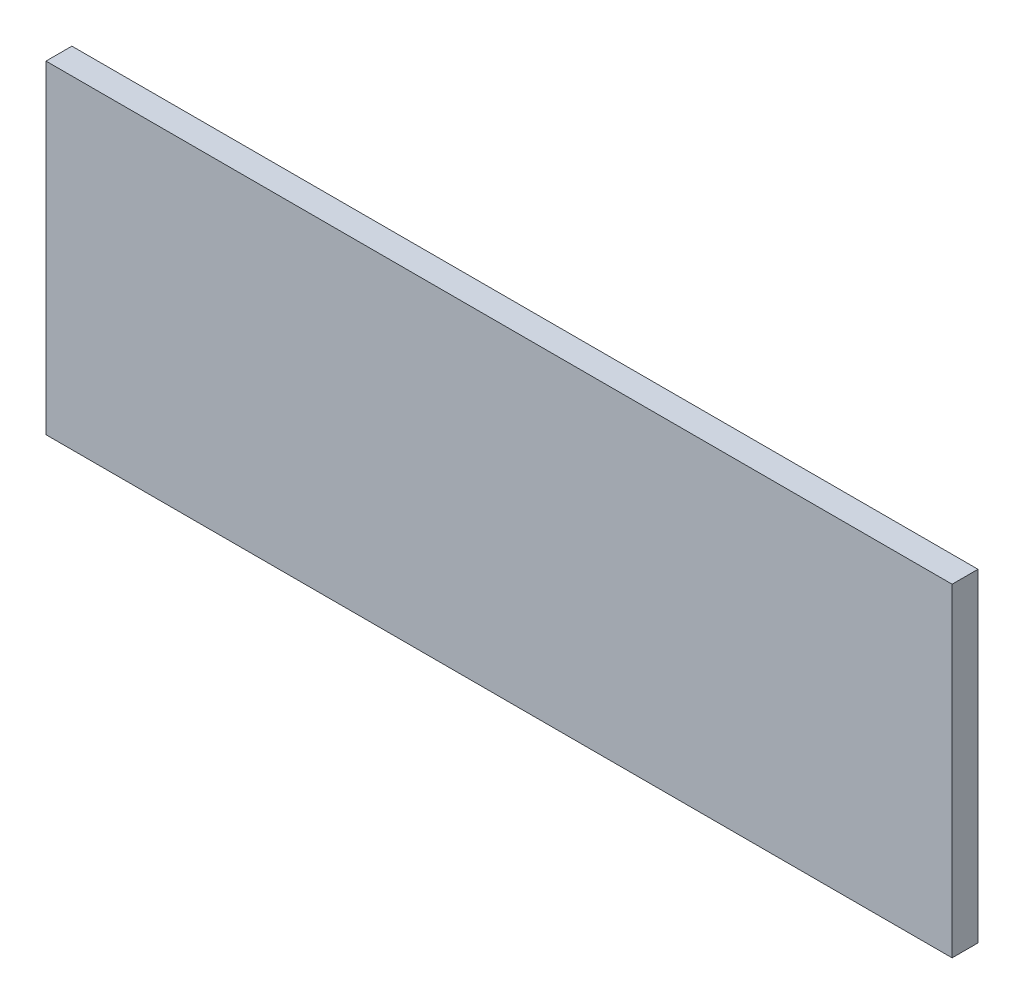
ISO-10303-21;
HEADER;
FILE_DESCRIPTION(('STEP AP214'),'2;1');
FILE_NAME('part.step','',(''),(''),'','','');
FILE_SCHEMA(('AUTOMOTIVE_DESIGN { 1 0 10303 214 1 1 1 1 }'));
ENDSEC;
DATA;
#1=APPLICATION_CONTEXT('core data for automotive mechanical design processes');
#2=APPLICATION_PROTOCOL_DEFINITION('international standard','automotive_design',2000,#1);
#3=PRODUCT_CONTEXT('',#1,'mechanical');
#4=PRODUCT('Part','Part','',(#3));
#5=PRODUCT_RELATED_PRODUCT_CATEGORY('part','',(#4));
#6=PRODUCT_DEFINITION_FORMATION('','',#4);
#7=PRODUCT_DEFINITION_CONTEXT('part definition',#1,'design');
#8=PRODUCT_DEFINITION('design','',#6,#7);
#9=PRODUCT_DEFINITION_SHAPE('','',#8);
#10=(LENGTH_UNIT() NAMED_UNIT(*) SI_UNIT(.MILLI.,.METRE.));
#11=(NAMED_UNIT(*) PLANE_ANGLE_UNIT() SI_UNIT($,.RADIAN.));
#12=(NAMED_UNIT(*) SI_UNIT($,.STERADIAN.) SOLID_ANGLE_UNIT());
#13=UNCERTAINTY_MEASURE_WITH_UNIT(LENGTH_MEASURE(1.E-05),#10,'distance_accuracy_value','');
#14=(GEOMETRIC_REPRESENTATION_CONTEXT(3) GLOBAL_UNCERTAINTY_ASSIGNED_CONTEXT((#13)) GLOBAL_UNIT_ASSIGNED_CONTEXT((#10,
#11,#12)) REPRESENTATION_CONTEXT('',''));
#15=CARTESIAN_POINT('',(0.,0.,0.));
#16=DIRECTION('',(0.,0.,1.));
#17=DIRECTION('',(1.,0.,0.));
#18=AXIS2_PLACEMENT_3D('',#15,#16,#17);
#19=CARTESIAN_POINT('',(-350.,-125.,20.));
#20=DIRECTION('',(1.,0.,0.));
#21=DIRECTION('',(0.,0.,-1.));
#22=AXIS2_PLACEMENT_3D('',#19,#20,#21);
#23=PLANE('',#22);
#24=DIRECTION('',(0.,-1.,0.));
#25=VECTOR('',#24,1.);
#26=CARTESIAN_POINT('',(-350.,-125.,0.));
#27=LINE('',#26,#25);
#28=CARTESIAN_POINT('',(-350.,125.,0.));
#29=VERTEX_POINT('',#28);
#30=CARTESIAN_POINT('',(-350.,-125.,0.));
#31=VERTEX_POINT('',#30);
#32=EDGE_CURVE('E93',#29,#31,#27,.T.);
#33=ORIENTED_EDGE('',*,*,#32,.T.);
#34=DIRECTION('',(0.,0.,-1.));
#35=VECTOR('',#34,1.);
#36=CARTESIAN_POINT('',(-350.,-125.,20.));
#37=LINE('',#36,#35);
#38=CARTESIAN_POINT('',(-350.,-125.,20.));
#39=VERTEX_POINT('',#38);
#40=EDGE_CURVE('E11',#39,#31,#37,.T.);
#41=ORIENTED_EDGE('',*,*,#40,.F.);
#42=DIRECTION('',(0.,-1.,0.));
#43=VECTOR('',#42,1.);
#44=CARTESIAN_POINT('',(-350.,-125.,20.));
#45=LINE('',#44,#43);
#46=CARTESIAN_POINT('',(-350.,125.,20.));
#47=VERTEX_POINT('',#46);
#48=EDGE_CURVE('E81',#47,#39,#45,.T.);
#49=ORIENTED_EDGE('',*,*,#48,.F.);
#50=DIRECTION('',(0.,0.,-1.));
#51=VECTOR('',#50,1.);
#52=CARTESIAN_POINT('',(-350.,125.,20.));
#53=LINE('',#52,#51);
#54=EDGE_CURVE('E89',#47,#29,#53,.T.);
#55=ORIENTED_EDGE('',*,*,#54,.T.);
#56=EDGE_LOOP('',(#33,#41,#49,#55));
#57=FACE_BOUND('',#56,.T.);
#58=ADVANCED_FACE('F30',(#57),#23,.F.);
#59=CARTESIAN_POINT('',(-350.,-125.,20.));
#60=DIRECTION('',(0.,1.,0.));
#61=DIRECTION('',(0.,0.,1.));
#62=AXIS2_PLACEMENT_3D('',#59,#60,#61);
#63=PLANE('',#62);
#64=DIRECTION('',(1.,0.,0.));
#65=VECTOR('',#64,1.);
#66=CARTESIAN_POINT('',(-350.,-125.,0.));
#67=LINE('',#66,#65);
#68=CARTESIAN_POINT('',(350.,-125.,0.));
#69=VERTEX_POINT('',#68);
#70=EDGE_CURVE('E85',#31,#69,#67,.T.);
#71=ORIENTED_EDGE('',*,*,#70,.T.);
#72=DIRECTION('',(0.,0.,-1.));
#73=VECTOR('',#72,1.);
#74=CARTESIAN_POINT('',(350.,-125.,20.));
#75=LINE('',#74,#73);
#76=CARTESIAN_POINT('',(350.,-125.,20.));
#77=VERTEX_POINT('',#76);
#78=EDGE_CURVE('E38',#77,#69,#75,.T.);
#79=ORIENTED_EDGE('',*,*,#78,.F.);
#80=DIRECTION('',(1.,0.,0.));
#81=VECTOR('',#80,1.);
#82=CARTESIAN_POINT('',(-350.,-125.,20.));
#83=LINE('',#82,#81);
#84=EDGE_CURVE('E76',#39,#77,#83,.T.);
#85=ORIENTED_EDGE('',*,*,#84,.F.);
#86=ORIENTED_EDGE('',*,*,#40,.T.);
#87=EDGE_LOOP('',(#71,#79,#85,#86));
#88=FACE_BOUND('',#87,.T.);
#89=ADVANCED_FACE('F84',(#88),#63,.F.);
#90=CARTESIAN_POINT('',(350.,-125.,20.));
#91=DIRECTION('',(-1.,0.,0.));
#92=DIRECTION('',(0.,0.,1.));
#93=AXIS2_PLACEMENT_3D('',#90,#91,#92);
#94=PLANE('',#93);
#95=DIRECTION('',(0.,1.,0.));
#96=VECTOR('',#95,1.);
#97=CARTESIAN_POINT('',(350.,-125.,0.));
#98=LINE('',#97,#96);
#99=CARTESIAN_POINT('',(350.,125.,0.));
#100=VERTEX_POINT('',#99);
#101=EDGE_CURVE('E63',#69,#100,#98,.T.);
#102=ORIENTED_EDGE('',*,*,#101,.T.);
#103=DIRECTION('',(0.,0.,-1.));
#104=VECTOR('',#103,1.);
#105=CARTESIAN_POINT('',(350.,125.,20.));
#106=LINE('',#105,#104);
#107=CARTESIAN_POINT('',(350.,125.,20.));
#108=VERTEX_POINT('',#107);
#109=EDGE_CURVE('E86',#108,#100,#106,.T.);
#110=ORIENTED_EDGE('',*,*,#109,.F.);
#111=DIRECTION('',(0.,1.,0.));
#112=VECTOR('',#111,1.);
#113=CARTESIAN_POINT('',(350.,-125.,20.));
#114=LINE('',#113,#112);
#115=EDGE_CURVE('E79',#77,#108,#114,.T.);
#116=ORIENTED_EDGE('',*,*,#115,.F.);
#117=ORIENTED_EDGE('',*,*,#78,.T.);
#118=EDGE_LOOP('',(#102,#110,#116,#117));
#119=FACE_BOUND('',#118,.T.);
#120=ADVANCED_FACE('F87',(#119),#94,.F.);
#121=CARTESIAN_POINT('',(-350.,125.,20.));
#122=DIRECTION('',(0.,-1.,0.));
#123=DIRECTION('',(0.,0.,-1.));
#124=AXIS2_PLACEMENT_3D('',#121,#122,#123);
#125=PLANE('',#124);
#126=DIRECTION('',(-1.,0.,0.));
#127=VECTOR('',#126,1.);
#128=CARTESIAN_POINT('',(-350.,125.,0.));
#129=LINE('',#128,#127);
#130=EDGE_CURVE('E69',#100,#29,#129,.T.);
#131=ORIENTED_EDGE('',*,*,#130,.T.);
#132=ORIENTED_EDGE('',*,*,#54,.F.);
#133=DIRECTION('',(-1.,0.,0.));
#134=VECTOR('',#133,1.);
#135=CARTESIAN_POINT('',(-350.,125.,20.));
#136=LINE('',#135,#134);
#137=EDGE_CURVE('E46',#108,#47,#136,.T.);
#138=ORIENTED_EDGE('',*,*,#137,.F.);
#139=ORIENTED_EDGE('',*,*,#109,.T.);
#140=EDGE_LOOP('',(#131,#132,#138,#139));
#141=FACE_BOUND('',#140,.T.);
#142=ADVANCED_FACE('F100',(#141),#125,.F.);
#143=CARTESIAN_POINT('',(-350.,125.,20.));
#144=DIRECTION('',(0.,0.,-1.));
#145=DIRECTION('',(-1.,0.,0.));
#146=AXIS2_PLACEMENT_3D('',#143,#144,#145);
#147=PLANE('',#146);
#148=ORIENTED_EDGE('',*,*,#48,.T.);
#149=ORIENTED_EDGE('',*,*,#84,.T.);
#150=ORIENTED_EDGE('',*,*,#115,.T.);
#151=ORIENTED_EDGE('',*,*,#137,.T.);
#152=EDGE_LOOP('',(#148,#149,#150,#151));
#153=FACE_BOUND('',#152,.T.);
#154=ADVANCED_FACE('F77',(#153),#147,.F.);
#155=CARTESIAN_POINT('',(-350.,125.,0.));
#156=DIRECTION('',(0.,0.,-1.));
#157=DIRECTION('',(-1.,0.,0.));
#158=AXIS2_PLACEMENT_3D('',#155,#156,#157);
#159=PLANE('',#158);
#160=ORIENTED_EDGE('',*,*,#32,.F.);
#161=ORIENTED_EDGE('',*,*,#130,.F.);
#162=ORIENTED_EDGE('',*,*,#101,.F.);
#163=ORIENTED_EDGE('',*,*,#70,.F.);
#164=EDGE_LOOP('',(#160,#161,#162,#163));
#165=FACE_BOUND('',#164,.T.);
#166=ADVANCED_FACE('F103',(#165),#159,.T.);
#167=CLOSED_SHELL('',(#58,#89,#120,#142,#154,#166));
#168=MANIFOLD_SOLID_BREP('B2',#167);
#169=ADVANCED_BREP_SHAPE_REPRESENTATION('',(#18,#168),#14);
#170=SHAPE_DEFINITION_REPRESENTATION(#9,#169);
ENDSEC;
END-ISO-10303-21;
